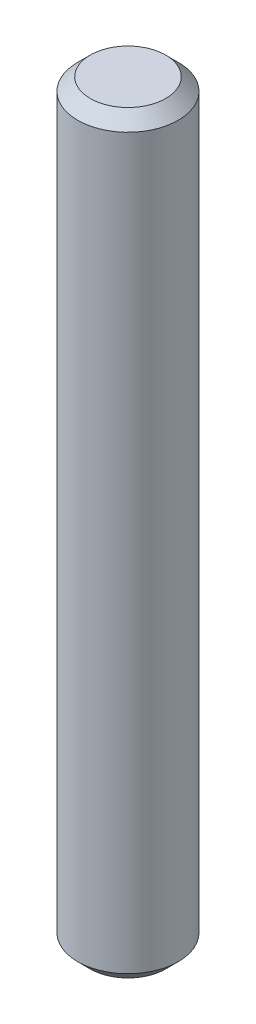
ISO-10303-21;
HEADER;
FILE_DESCRIPTION(('STEP AP214'),'2;1');
FILE_NAME('part.step','',(''),(''),'','','');
FILE_SCHEMA(('AUTOMOTIVE_DESIGN { 1 0 10303 214 1 1 1 1 }'));
ENDSEC;
DATA;
#1=APPLICATION_CONTEXT('core data for automotive mechanical design processes');
#2=APPLICATION_PROTOCOL_DEFINITION('international standard','automotive_design',2000,#1);
#3=PRODUCT_CONTEXT('',#1,'mechanical');
#4=PRODUCT('Part','Part','',(#3));
#5=PRODUCT_RELATED_PRODUCT_CATEGORY('part','',(#4));
#6=PRODUCT_DEFINITION_FORMATION('','',#4);
#7=PRODUCT_DEFINITION_CONTEXT('part definition',#1,'design');
#8=PRODUCT_DEFINITION('design','',#6,#7);
#9=PRODUCT_DEFINITION_SHAPE('','',#8);
#10=(LENGTH_UNIT() NAMED_UNIT(*) SI_UNIT(.MILLI.,.METRE.));
#11=(NAMED_UNIT(*) PLANE_ANGLE_UNIT() SI_UNIT($,.RADIAN.));
#12=(NAMED_UNIT(*) SI_UNIT($,.STERADIAN.) SOLID_ANGLE_UNIT());
#13=UNCERTAINTY_MEASURE_WITH_UNIT(LENGTH_MEASURE(1.E-05),#10,'distance_accuracy_value','');
#14=(GEOMETRIC_REPRESENTATION_CONTEXT(3) GLOBAL_UNCERTAINTY_ASSIGNED_CONTEXT((#13)) GLOBAL_UNIT_ASSIGNED_CONTEXT((#10,
#11,#12)) REPRESENTATION_CONTEXT('',''));
#15=CARTESIAN_POINT('',(0.,0.,0.));
#16=DIRECTION('',(0.,0.,1.));
#17=DIRECTION('',(1.,0.,0.));
#18=AXIS2_PLACEMENT_3D('',#15,#16,#17);
#19=CARTESIAN_POINT('',(0.,30.,0.));
#20=DIRECTION('',(0.,-1.,0.));
#21=DIRECTION('',(0.,0.,-1.));
#22=AXIS2_PLACEMENT_3D('',#19,#20,#21);
#23=CYLINDRICAL_SURFACE('',#22,2.);
#24=CARTESIAN_POINT('',(0.,29.5,0.));
#25=DIRECTION('',(0.,1.,0.));
#26=DIRECTION('',(0.,0.,1.));
#27=AXIS2_PLACEMENT_3D('',#24,#25,#26);
#28=CIRCLE('',#27,2.);
#29=CARTESIAN_POINT('',(0.,29.5,2.));
#30=VERTEX_POINT('',#29);
#31=EDGE_CURVE('E10',#30,#30,#28,.F.);
#32=ORIENTED_EDGE('',*,*,#31,.T.);
#33=EDGE_LOOP('',(#32));
#34=FACE_BOUND('',#33,.T.);
#35=CARTESIAN_POINT('',(0.,0.5,0.));
#36=DIRECTION('',(0.,1.,0.));
#37=DIRECTION('',(0.,0.,1.));
#38=AXIS2_PLACEMENT_3D('',#35,#36,#37);
#39=CIRCLE('',#38,2.);
#40=CARTESIAN_POINT('',(0.,0.5,2.));
#41=VERTEX_POINT('',#40);
#42=EDGE_CURVE('E58',#41,#41,#39,.T.);
#43=ORIENTED_EDGE('',*,*,#42,.T.);
#44=EDGE_LOOP('',(#43));
#45=FACE_BOUND('',#44,.T.);
#46=ADVANCED_FACE('F39',(#34,#45),#23,.T.);
#47=CARTESIAN_POINT('',(0.,30.,0.));
#48=DIRECTION('',(0.,1.,0.));
#49=DIRECTION('',(0.,0.,1.));
#50=AXIS2_PLACEMENT_3D('',#47,#48,#49);
#51=PLANE('',#50);
#52=CARTESIAN_POINT('',(0.,30.,0.));
#53=DIRECTION('',(0.,1.,0.));
#54=DIRECTION('',(0.,0.,1.));
#55=AXIS2_PLACEMENT_3D('',#52,#53,#54);
#56=CIRCLE('',#55,1.5);
#57=CARTESIAN_POINT('',(0.,30.,1.5));
#58=VERTEX_POINT('',#57);
#59=EDGE_CURVE('E48',#58,#58,#56,.T.);
#60=ORIENTED_EDGE('',*,*,#59,.T.);
#61=EDGE_LOOP('',(#60));
#62=FACE_BOUND('',#61,.T.);
#63=ADVANCED_FACE('F75',(#62),#51,.T.);
#64=CARTESIAN_POINT('',(0.,0.,0.));
#65=DIRECTION('',(0.,1.,0.));
#66=DIRECTION('',(0.,0.,1.));
#67=AXIS2_PLACEMENT_3D('',#64,#65,#66);
#68=PLANE('',#67);
#69=CARTESIAN_POINT('',(0.,0.,0.));
#70=DIRECTION('',(0.,1.,0.));
#71=DIRECTION('',(0.,0.,1.));
#72=AXIS2_PLACEMENT_3D('',#69,#70,#71);
#73=CIRCLE('',#72,1.5);
#74=CARTESIAN_POINT('',(0.,0.,1.5));
#75=VERTEX_POINT('',#74);
#76=EDGE_CURVE('E53',#75,#75,#73,.F.);
#77=ORIENTED_EDGE('',*,*,#76,.T.);
#78=EDGE_LOOP('',(#77));
#79=FACE_BOUND('',#78,.T.);
#80=ADVANCED_FACE('F68',(#79),#68,.F.);
#81=CARTESIAN_POINT('',(0.,0.5,0.));
#82=DIRECTION('',(0.,1.,0.));
#83=DIRECTION('',(0.,0.,1.));
#84=AXIS2_PLACEMENT_3D('',#81,#82,#83);
#85=CONICAL_SURFACE('',#84,2.,0.78539816339745);
#86=ORIENTED_EDGE('',*,*,#76,.F.);
#87=EDGE_LOOP('',(#86));
#88=FACE_BOUND('',#87,.T.);
#89=ORIENTED_EDGE('',*,*,#42,.F.);
#90=EDGE_LOOP('',(#89));
#91=FACE_BOUND('',#90,.T.);
#92=ADVANCED_FACE('F66',(#88,#91),#85,.T.);
#93=CARTESIAN_POINT('',(0.,30.,0.));
#94=DIRECTION('',(0.,-1.,0.));
#95=DIRECTION('',(0.,0.,-1.));
#96=AXIS2_PLACEMENT_3D('',#93,#94,#95);
#97=CONICAL_SURFACE('',#96,1.5,0.785398163397447);
#98=ORIENTED_EDGE('',*,*,#31,.F.);
#99=EDGE_LOOP('',(#98));
#100=FACE_BOUND('',#99,.T.);
#101=ORIENTED_EDGE('',*,*,#59,.F.);
#102=EDGE_LOOP('',(#101));
#103=FACE_BOUND('',#102,.T.);
#104=ADVANCED_FACE('F42',(#100,#103),#97,.T.);
#105=CLOSED_SHELL('',(#46,#63,#80,#92,#104));
#106=MANIFOLD_SOLID_BREP('B2',#105);
#107=ADVANCED_BREP_SHAPE_REPRESENTATION('',(#18,#106),#14);
#108=SHAPE_DEFINITION_REPRESENTATION(#9,#107);
ENDSEC;
END-ISO-10303-21;
